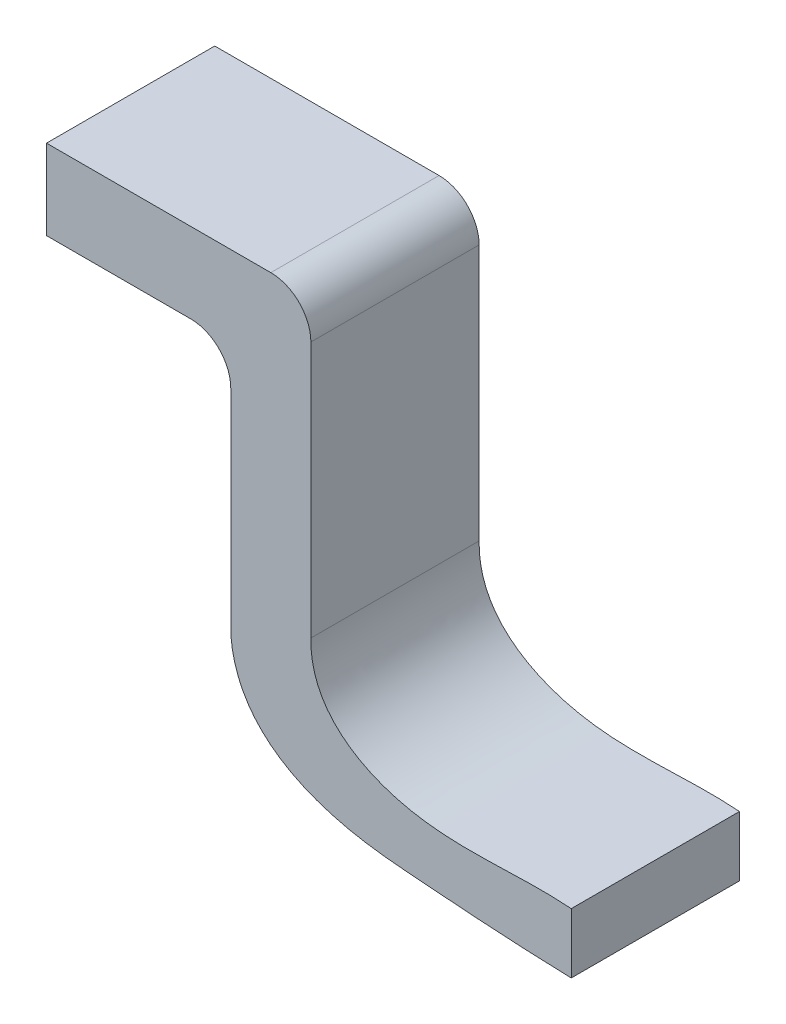
ISO-10303-21;
HEADER;
FILE_DESCRIPTION(('STEP AP214'),'2;1');
FILE_NAME('part.step','',(''),(''),'','','');
FILE_SCHEMA(('AUTOMOTIVE_DESIGN { 1 0 10303 214 1 1 1 1 }'));
ENDSEC;
DATA;
#1=APPLICATION_CONTEXT('core data for automotive mechanical design processes');
#2=APPLICATION_PROTOCOL_DEFINITION('international standard','automotive_design',2000,#1);
#3=PRODUCT_CONTEXT('',#1,'mechanical');
#4=PRODUCT('Part','Part','',(#3));
#5=PRODUCT_RELATED_PRODUCT_CATEGORY('part','',(#4));
#6=PRODUCT_DEFINITION_FORMATION('','',#4);
#7=PRODUCT_DEFINITION_CONTEXT('part definition',#1,'design');
#8=PRODUCT_DEFINITION('design','',#6,#7);
#9=PRODUCT_DEFINITION_SHAPE('','',#8);
#10=(LENGTH_UNIT() NAMED_UNIT(*) SI_UNIT(.MILLI.,.METRE.));
#11=(NAMED_UNIT(*) PLANE_ANGLE_UNIT() SI_UNIT($,.RADIAN.));
#12=(NAMED_UNIT(*) SI_UNIT($,.STERADIAN.) SOLID_ANGLE_UNIT());
#13=UNCERTAINTY_MEASURE_WITH_UNIT(LENGTH_MEASURE(1.E-05),#10,'distance_accuracy_value','');
#14=(GEOMETRIC_REPRESENTATION_CONTEXT(3) GLOBAL_UNCERTAINTY_ASSIGNED_CONTEXT((#13)) GLOBAL_UNIT_ASSIGNED_CONTEXT((#10,
#11,#12)) REPRESENTATION_CONTEXT('',''));
#15=CARTESIAN_POINT('',(0.,0.,0.));
#16=DIRECTION('',(0.,0.,1.));
#17=DIRECTION('',(1.,0.,0.));
#18=AXIS2_PLACEMENT_3D('',#15,#16,#17);
#19=CARTESIAN_POINT('',(0.66,0.41001040878674,0.42));
#20=CARTESIAN_POINT('',(0.657020770868003,0.26558953962111,0.42));
#21=CARTESIAN_POINT('',(0.908391177508119,0.109635418959166,0.42));
#22=CARTESIAN_POINT('',(1.17099207201537,0.160633720791014,0.42));
#23=CARTESIAN_POINT('',(1.31,0.15,0.42));
#24=B_SPLINE_CURVE_WITH_KNOTS('',3,(#19,#20,#21,#22,#23),.UNSPECIFIED.,.F.,.F.,(4,1,4),(0.,
0.461377354231246,1.),.UNSPECIFIED.);
#25=DIRECTION('',(0.,0.,-1.));
#26=VECTOR('',#25,1.);
#27=SURFACE_OF_LINEAR_EXTRUSION('',#24,#26);
#28=CARTESIAN_POINT('',(0.66,0.41001040878674,0.));
#29=CARTESIAN_POINT('',(0.657020770868003,0.26558953962111,0.));
#30=CARTESIAN_POINT('',(0.908391177508119,0.109635418959166,0.));
#31=CARTESIAN_POINT('',(1.17099207201537,0.160633720791014,0.));
#32=CARTESIAN_POINT('',(1.31,0.15,0.));
#33=B_SPLINE_CURVE_WITH_KNOTS('',3,(#28,#29,#30,#31,#32),.UNSPECIFIED.,.F.,.F.,(4,1,4),(0.,
0.461377354231246,1.),.UNSPECIFIED.);
#34=CARTESIAN_POINT('',(0.66,0.41001040878674,0.));
#35=VERTEX_POINT('',#34);
#36=CARTESIAN_POINT('',(1.31,0.15,0.));
#37=VERTEX_POINT('',#36);
#38=EDGE_CURVE('E187',#35,#37,#33,.T.);
#39=ORIENTED_EDGE('',*,*,#38,.F.);
#40=DIRECTION('',(0.,0.,-1.));
#41=VECTOR('',#40,1.);
#42=CARTESIAN_POINT('',(0.66,0.41001040878674,0.42));
#43=LINE('',#42,#41);
#44=CARTESIAN_POINT('',(0.66,0.41001040878674,0.42));
#45=VERTEX_POINT('',#44);
#46=EDGE_CURVE('E11',#45,#35,#43,.T.);
#47=ORIENTED_EDGE('',*,*,#46,.F.);
#48=CARTESIAN_POINT('',(1.31,0.15,0.42));
#49=VERTEX_POINT('',#48);
#50=EDGE_CURVE('E215',#45,#49,#24,.T.);
#51=ORIENTED_EDGE('',*,*,#50,.T.);
#52=DIRECTION('',(0.,0.,-1.));
#53=VECTOR('',#52,1.);
#54=CARTESIAN_POINT('',(1.31,0.15,0.42));
#55=LINE('',#54,#53);
#56=EDGE_CURVE('E51',#49,#37,#55,.T.);
#57=ORIENTED_EDGE('',*,*,#56,.T.);
#58=EDGE_LOOP('',(#39,#47,#51,#57));
#59=FACE_BOUND('',#58,.T.);
#60=ADVANCED_FACE('F34',(#59),#27,.T.);
#61=CARTESIAN_POINT('',(0.66,0.,0.42));
#62=DIRECTION('',(1.,0.,0.));
#63=DIRECTION('',(0.,1.,0.));
#64=AXIS2_PLACEMENT_3D('',#61,#62,#63);
#65=PLANE('',#64);
#66=DIRECTION('',(0.,-1.,0.));
#67=VECTOR('',#66,1.);
#68=CARTESIAN_POINT('',(0.66,0.,0.));
#69=LINE('',#68,#67);
#70=CARTESIAN_POINT('',(0.66,1.05,0.));
#71=VERTEX_POINT('',#70);
#72=EDGE_CURVE('E181',#71,#35,#69,.T.);
#73=ORIENTED_EDGE('',*,*,#72,.F.);
#74=DIRECTION('',(0.,0.,-1.));
#75=VECTOR('',#74,1.);
#76=CARTESIAN_POINT('',(0.66,1.05,0.42));
#77=LINE('',#76,#75);
#78=CARTESIAN_POINT('',(0.66,1.05,0.42));
#79=VERTEX_POINT('',#78);
#80=EDGE_CURVE('E43',#79,#71,#77,.T.);
#81=ORIENTED_EDGE('',*,*,#80,.F.);
#82=DIRECTION('',(0.,-1.,0.));
#83=VECTOR('',#82,1.);
#84=CARTESIAN_POINT('',(0.66,0.,0.42));
#85=LINE('',#84,#83);
#86=EDGE_CURVE('E243',#79,#45,#85,.T.);
#87=ORIENTED_EDGE('',*,*,#86,.T.);
#88=ORIENTED_EDGE('',*,*,#46,.T.);
#89=EDGE_LOOP('',(#73,#81,#87,#88));
#90=FACE_BOUND('',#89,.T.);
#91=ADVANCED_FACE('F172',(#90),#65,.T.);
#92=CARTESIAN_POINT('',(0.56,1.05,0.42));
#93=DIRECTION('',(0.,0.,-1.));
#94=DIRECTION('',(-1.,0.,0.));
#95=AXIS2_PLACEMENT_3D('',#92,#93,#94);
#96=CYLINDRICAL_SURFACE('',#95,0.1);
#97=CARTESIAN_POINT('',(0.56,1.05,0.));
#98=DIRECTION('',(0.,0.,1.));
#99=DIRECTION('',(1.,0.,0.));
#100=AXIS2_PLACEMENT_3D('',#97,#98,#99);
#101=CIRCLE('',#100,0.1);
#102=CARTESIAN_POINT('',(0.56,1.15,0.));
#103=VERTEX_POINT('',#102);
#104=EDGE_CURVE('E186',#71,#103,#101,.T.);
#105=ORIENTED_EDGE('',*,*,#104,.T.);
#106=DIRECTION('',(0.,0.,-1.));
#107=VECTOR('',#106,1.);
#108=CARTESIAN_POINT('',(0.56,1.15,0.42));
#109=LINE('',#108,#107);
#110=CARTESIAN_POINT('',(0.56,1.15,0.42));
#111=VERTEX_POINT('',#110);
#112=EDGE_CURVE('E226',#111,#103,#109,.T.);
#113=ORIENTED_EDGE('',*,*,#112,.F.);
#114=CARTESIAN_POINT('',(0.56,1.05,0.42));
#115=DIRECTION('',(0.,0.,1.));
#116=DIRECTION('',(1.,0.,0.));
#117=AXIS2_PLACEMENT_3D('',#114,#115,#116);
#118=CIRCLE('',#117,0.1);
#119=EDGE_CURVE('E228',#79,#111,#118,.T.);
#120=ORIENTED_EDGE('',*,*,#119,.F.);
#121=ORIENTED_EDGE('',*,*,#80,.T.);
#122=EDGE_LOOP('',(#105,#113,#120,#121));
#123=FACE_BOUND('',#122,.T.);
#124=ADVANCED_FACE('F169',(#123),#96,.T.);
#125=CARTESIAN_POINT('',(0.,1.15,0.42));
#126=DIRECTION('',(0.,1.,0.));
#127=DIRECTION('',(0.,0.,1.));
#128=AXIS2_PLACEMENT_3D('',#125,#126,#127);
#129=PLANE('',#128);
#130=DIRECTION('',(1.,0.,0.));
#131=VECTOR('',#130,1.);
#132=CARTESIAN_POINT('',(0.,1.15,0.));
#133=LINE('',#132,#131);
#134=CARTESIAN_POINT('',(0.,1.15,0.));
#135=VERTEX_POINT('',#134);
#136=EDGE_CURVE('E190',#135,#103,#133,.T.);
#137=ORIENTED_EDGE('',*,*,#136,.F.);
#138=DIRECTION('',(0.,0.,-1.));
#139=VECTOR('',#138,1.);
#140=CARTESIAN_POINT('',(0.,1.15,0.42));
#141=LINE('',#140,#139);
#142=CARTESIAN_POINT('',(0.,1.15,0.42));
#143=VERTEX_POINT('',#142);
#144=EDGE_CURVE('E224',#143,#135,#141,.T.);
#145=ORIENTED_EDGE('',*,*,#144,.F.);
#146=DIRECTION('',(1.,0.,0.));
#147=VECTOR('',#146,1.);
#148=CARTESIAN_POINT('',(0.,1.15,0.42));
#149=LINE('',#148,#147);
#150=EDGE_CURVE('E236',#143,#111,#149,.T.);
#151=ORIENTED_EDGE('',*,*,#150,.T.);
#152=ORIENTED_EDGE('',*,*,#112,.T.);
#153=EDGE_LOOP('',(#137,#145,#151,#152));
#154=FACE_BOUND('',#153,.T.);
#155=ADVANCED_FACE('F165',(#154),#129,.T.);
#156=CARTESIAN_POINT('',(0.,0.,0.42));
#157=DIRECTION('',(-1.,0.,0.));
#158=DIRECTION('',(0.,-1.,0.));
#159=AXIS2_PLACEMENT_3D('',#156,#157,#158);
#160=PLANE('',#159);
#161=DIRECTION('',(0.,1.,0.));
#162=VECTOR('',#161,1.);
#163=CARTESIAN_POINT('',(0.,0.,0.));
#164=LINE('',#163,#162);
#165=CARTESIAN_POINT('',(0.,0.95,0.));
#166=VERTEX_POINT('',#165);
#167=EDGE_CURVE('E197',#166,#135,#164,.T.);
#168=ORIENTED_EDGE('',*,*,#167,.F.);
#169=DIRECTION('',(0.,0.,-1.));
#170=VECTOR('',#169,1.);
#171=CARTESIAN_POINT('',(0.,0.95,0.42));
#172=LINE('',#171,#170);
#173=CARTESIAN_POINT('',(0.,0.95,0.42));
#174=VERTEX_POINT('',#173);
#175=EDGE_CURVE('E222',#174,#166,#172,.T.);
#176=ORIENTED_EDGE('',*,*,#175,.F.);
#177=DIRECTION('',(0.,1.,0.));
#178=VECTOR('',#177,1.);
#179=CARTESIAN_POINT('',(0.,0.,0.42));
#180=LINE('',#179,#178);
#181=EDGE_CURVE('E239',#174,#143,#180,.T.);
#182=ORIENTED_EDGE('',*,*,#181,.T.);
#183=ORIENTED_EDGE('',*,*,#144,.T.);
#184=EDGE_LOOP('',(#168,#176,#182,#183));
#185=FACE_BOUND('',#184,.T.);
#186=ADVANCED_FACE('F161',(#185),#160,.T.);
#187=CARTESIAN_POINT('',(0.,0.95,0.42));
#188=DIRECTION('',(0.,1.,0.));
#189=DIRECTION('',(-1.,0.,0.));
#190=AXIS2_PLACEMENT_3D('',#187,#188,#189);
#191=PLANE('',#190);
#192=DIRECTION('',(1.,0.,0.));
#193=VECTOR('',#192,1.);
#194=CARTESIAN_POINT('',(0.,0.95,0.));
#195=LINE('',#194,#193);
#196=CARTESIAN_POINT('',(0.36,0.95,0.));
#197=VERTEX_POINT('',#196);
#198=EDGE_CURVE('E200',#166,#197,#195,.T.);
#199=ORIENTED_EDGE('',*,*,#198,.T.);
#200=DIRECTION('',(0.,0.,-1.));
#201=VECTOR('',#200,1.);
#202=CARTESIAN_POINT('',(0.36,0.95,0.42));
#203=LINE('',#202,#201);
#204=CARTESIAN_POINT('',(0.36,0.95,0.42));
#205=VERTEX_POINT('',#204);
#206=EDGE_CURVE('E219',#205,#197,#203,.T.);
#207=ORIENTED_EDGE('',*,*,#206,.F.);
#208=DIRECTION('',(1.,0.,0.));
#209=VECTOR('',#208,1.);
#210=CARTESIAN_POINT('',(0.,0.95,0.42));
#211=LINE('',#210,#209);
#212=EDGE_CURVE('E241',#174,#205,#211,.T.);
#213=ORIENTED_EDGE('',*,*,#212,.F.);
#214=ORIENTED_EDGE('',*,*,#175,.T.);
#215=EDGE_LOOP('',(#199,#207,#213,#214));
#216=FACE_BOUND('',#215,.T.);
#217=ADVANCED_FACE('F157',(#216),#191,.F.);
#218=CARTESIAN_POINT('',(0.36,0.85,0.42));
#219=DIRECTION('',(0.,0.,-1.));
#220=DIRECTION('',(-1.,0.,0.));
#221=AXIS2_PLACEMENT_3D('',#218,#219,#220);
#222=CYLINDRICAL_SURFACE('',#221,0.1);
#223=CARTESIAN_POINT('',(0.36,0.85,0.));
#224=DIRECTION('',(0.,0.,1.));
#225=DIRECTION('',(1.,0.,0.));
#226=AXIS2_PLACEMENT_3D('',#223,#224,#225);
#227=CIRCLE('',#226,0.1);
#228=CARTESIAN_POINT('',(0.46,0.85,0.));
#229=VERTEX_POINT('',#228);
#230=EDGE_CURVE('E202',#197,#229,#227,.F.);
#231=ORIENTED_EDGE('',*,*,#230,.T.);
#232=DIRECTION('',(0.,0.,-1.));
#233=VECTOR('',#232,1.);
#234=CARTESIAN_POINT('',(0.46,0.85,0.42));
#235=LINE('',#234,#233);
#236=CARTESIAN_POINT('',(0.46,0.85,0.42));
#237=VERTEX_POINT('',#236);
#238=EDGE_CURVE('E132',#237,#229,#235,.T.);
#239=ORIENTED_EDGE('',*,*,#238,.F.);
#240=CARTESIAN_POINT('',(0.36,0.85,0.42));
#241=DIRECTION('',(0.,0.,1.));
#242=DIRECTION('',(1.,0.,0.));
#243=AXIS2_PLACEMENT_3D('',#240,#241,#242);
#244=CIRCLE('',#243,0.1);
#245=EDGE_CURVE('E120',#205,#237,#244,.F.);
#246=ORIENTED_EDGE('',*,*,#245,.F.);
#247=ORIENTED_EDGE('',*,*,#206,.T.);
#248=EDGE_LOOP('',(#231,#239,#246,#247));
#249=FACE_BOUND('',#248,.T.);
#250=ADVANCED_FACE('F154',(#249),#222,.F.);
#251=CARTESIAN_POINT('',(0.46,0.,0.42));
#252=DIRECTION('',(1.,0.,0.));
#253=DIRECTION('',(0.,1.,0.));
#254=AXIS2_PLACEMENT_3D('',#251,#252,#253);
#255=PLANE('',#254);
#256=DIRECTION('',(0.,-1.,0.));
#257=VECTOR('',#256,1.);
#258=CARTESIAN_POINT('',(0.46,0.,0.));
#259=LINE('',#258,#257);
#260=CARTESIAN_POINT('',(0.46,0.317796194136848,0.));
#261=VERTEX_POINT('',#260);
#262=EDGE_CURVE('E129',#229,#261,#259,.T.);
#263=ORIENTED_EDGE('',*,*,#262,.T.);
#264=DIRECTION('',(0.,0.,-1.));
#265=VECTOR('',#264,1.);
#266=CARTESIAN_POINT('',(0.46,0.317796194136848,0.42));
#267=LINE('',#266,#265);
#268=CARTESIAN_POINT('',(0.46,0.317796194136848,0.42));
#269=VERTEX_POINT('',#268);
#270=EDGE_CURVE('E126',#269,#261,#267,.T.);
#271=ORIENTED_EDGE('',*,*,#270,.F.);
#272=DIRECTION('',(0.,-1.,0.));
#273=VECTOR('',#272,1.);
#274=CARTESIAN_POINT('',(0.46,0.,0.42));
#275=LINE('',#274,#273);
#276=EDGE_CURVE('E113',#237,#269,#275,.T.);
#277=ORIENTED_EDGE('',*,*,#276,.F.);
#278=ORIENTED_EDGE('',*,*,#238,.T.);
#279=EDGE_LOOP('',(#263,#271,#277,#278));
#280=FACE_BOUND('',#279,.T.);
#281=ADVANCED_FACE('F127',(#280),#255,.F.);
#282=CARTESIAN_POINT('',(0.46,0.317796194136848,0.42));
#283=CARTESIAN_POINT('',(0.474880605750517,0.134638656194291,0.42));
#284=CARTESIAN_POINT('',(0.690978233055168,0.0441830939705508,0.42));
#285=CARTESIAN_POINT('',(0.947584462962543,0.0191407462392344,0.42));
#286=CARTESIAN_POINT('',(1.19243694065574,0.00284840776618112,0.42));
#287=CARTESIAN_POINT('',(1.31,0.,0.42));
#288=B_SPLINE_CURVE_WITH_KNOTS('',3,(#282,#283,#284,#285,#286,#287),.UNSPECIFIED.,.F.,.F.,(4,1,
1,4),(0.,0.373086953330992,0.499546572819767,0.782662078395963),.UNSPECIFIED.);
#289=DIRECTION('',(0.,0.,-1.));
#290=VECTOR('',#289,1.);
#291=SURFACE_OF_LINEAR_EXTRUSION('',#288,#290);
#292=CARTESIAN_POINT('',(0.46,0.317796194136848,0.));
#293=CARTESIAN_POINT('',(0.474880605750517,0.134638656194291,0.));
#294=CARTESIAN_POINT('',(0.690978233055168,0.0441830939705508,0.));
#295=CARTESIAN_POINT('',(0.947584462962543,0.0191407462392344,0.));
#296=CARTESIAN_POINT('',(1.19243694065574,0.00284840776618112,0.));
#297=CARTESIAN_POINT('',(1.31,0.,0.));
#298=B_SPLINE_CURVE_WITH_KNOTS('',3,(#292,#293,#294,#295,#296,#297),.UNSPECIFIED.,.F.,.F.,(4,1,
1,4),(0.,0.373086953330992,0.499546572819767,0.782662078395963),.UNSPECIFIED.);
#299=CARTESIAN_POINT('',(1.31,0.,0.));
#300=VERTEX_POINT('',#299);
#301=EDGE_CURVE('E205',#261,#300,#298,.T.);
#302=ORIENTED_EDGE('',*,*,#301,.T.);
#303=DIRECTION('',(0.,0.,-1.));
#304=VECTOR('',#303,1.);
#305=CARTESIAN_POINT('',(1.31,0.,0.42));
#306=LINE('',#305,#304);
#307=CARTESIAN_POINT('',(1.31,0.,0.42));
#308=VERTEX_POINT('',#307);
#309=EDGE_CURVE('E83',#308,#300,#306,.T.);
#310=ORIENTED_EDGE('',*,*,#309,.F.);
#311=EDGE_CURVE('E118',#269,#308,#288,.T.);
#312=ORIENTED_EDGE('',*,*,#311,.F.);
#313=ORIENTED_EDGE('',*,*,#270,.T.);
#314=EDGE_LOOP('',(#302,#310,#312,#313));
#315=FACE_BOUND('',#314,.T.);
#316=ADVANCED_FACE('F134',(#315),#291,.F.);
#317=CARTESIAN_POINT('',(1.31,0.,0.42));
#318=DIRECTION('',(1.,0.,0.));
#319=DIRECTION('',(0.,1.,0.));
#320=AXIS2_PLACEMENT_3D('',#317,#318,#319);
#321=PLANE('',#320);
#322=DIRECTION('',(0.,-1.,0.));
#323=VECTOR('',#322,1.);
#324=CARTESIAN_POINT('',(1.31,0.,0.));
#325=LINE('',#324,#323);
#326=EDGE_CURVE('E209',#37,#300,#325,.T.);
#327=ORIENTED_EDGE('',*,*,#326,.F.);
#328=ORIENTED_EDGE('',*,*,#56,.F.);
#329=DIRECTION('',(0.,-1.,0.));
#330=VECTOR('',#329,1.);
#331=CARTESIAN_POINT('',(1.31,0.,0.42));
#332=LINE('',#331,#330);
#333=EDGE_CURVE('E135',#49,#308,#332,.T.);
#334=ORIENTED_EDGE('',*,*,#333,.T.);
#335=ORIENTED_EDGE('',*,*,#309,.T.);
#336=EDGE_LOOP('',(#327,#328,#334,#335));
#337=FACE_BOUND('',#336,.T.);
#338=ADVANCED_FACE('F150',(#337),#321,.T.);
#339=CARTESIAN_POINT('',(0.,0.,0.42));
#340=DIRECTION('',(0.,0.,1.));
#341=DIRECTION('',(1.,0.,0.));
#342=AXIS2_PLACEMENT_3D('',#339,#340,#341);
#343=PLANE('',#342);
#344=ORIENTED_EDGE('',*,*,#50,.F.);
#345=ORIENTED_EDGE('',*,*,#86,.F.);
#346=ORIENTED_EDGE('',*,*,#119,.T.);
#347=ORIENTED_EDGE('',*,*,#150,.F.);
#348=ORIENTED_EDGE('',*,*,#181,.F.);
#349=ORIENTED_EDGE('',*,*,#212,.T.);
#350=ORIENTED_EDGE('',*,*,#245,.T.);
#351=ORIENTED_EDGE('',*,*,#276,.T.);
#352=ORIENTED_EDGE('',*,*,#311,.T.);
#353=ORIENTED_EDGE('',*,*,#333,.F.);
#354=EDGE_LOOP('',(#344,#345,#346,#347,#348,#349,#350,#351,#352,#353));
#355=FACE_BOUND('',#354,.T.);
#356=ADVANCED_FACE('F115',(#355),#343,.T.);
#357=CARTESIAN_POINT('',(0.,0.,0.));
#358=DIRECTION('',(0.,0.,1.));
#359=DIRECTION('',(1.,0.,0.));
#360=AXIS2_PLACEMENT_3D('',#357,#358,#359);
#361=PLANE('',#360);
#362=ORIENTED_EDGE('',*,*,#38,.T.);
#363=ORIENTED_EDGE('',*,*,#326,.T.);
#364=ORIENTED_EDGE('',*,*,#301,.F.);
#365=ORIENTED_EDGE('',*,*,#262,.F.);
#366=ORIENTED_EDGE('',*,*,#230,.F.);
#367=ORIENTED_EDGE('',*,*,#198,.F.);
#368=ORIENTED_EDGE('',*,*,#167,.T.);
#369=ORIENTED_EDGE('',*,*,#136,.T.);
#370=ORIENTED_EDGE('',*,*,#104,.F.);
#371=ORIENTED_EDGE('',*,*,#72,.T.);
#372=EDGE_LOOP('',(#362,#363,#364,#365,#366,#367,#368,#369,#370,#371));
#373=FACE_BOUND('',#372,.T.);
#374=ADVANCED_FACE('F230',(#373),#361,.F.);
#375=CLOSED_SHELL('',(#60,#91,#124,#155,#186,#217,#250,#281,#316,#338,#356,#374));
#376=MANIFOLD_SOLID_BREP('B2',#375);
#377=ADVANCED_BREP_SHAPE_REPRESENTATION('',(#18,#376),#14);
#378=SHAPE_DEFINITION_REPRESENTATION(#9,#377);
ENDSEC;
END-ISO-10303-21;
